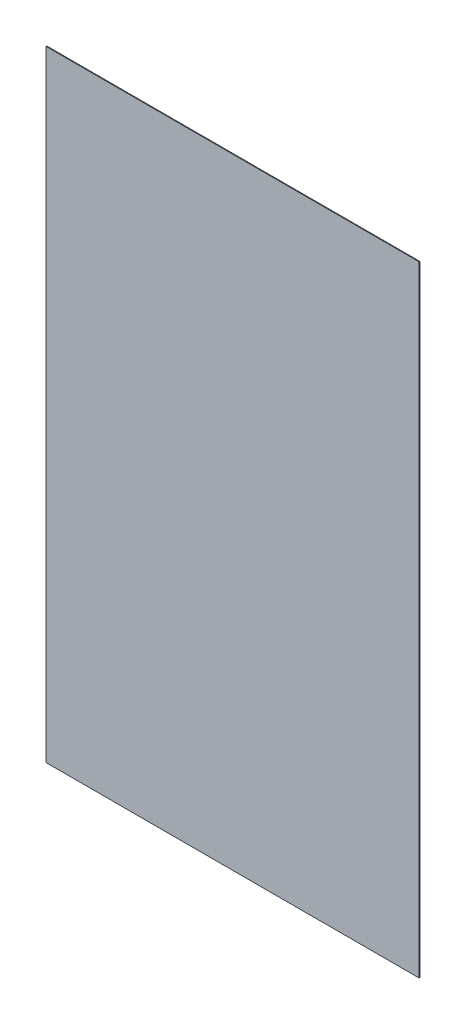
ISO-10303-21;
HEADER;
FILE_DESCRIPTION(('STEP AP214'),'2;1');
FILE_NAME('part.step','',(''),(''),'','','');
FILE_SCHEMA(('AUTOMOTIVE_DESIGN { 1 0 10303 214 1 1 1 1 }'));
ENDSEC;
DATA;
#1=APPLICATION_CONTEXT('core data for automotive mechanical design processes');
#2=APPLICATION_PROTOCOL_DEFINITION('international standard','automotive_design',2000,#1);
#3=PRODUCT_CONTEXT('',#1,'mechanical');
#4=PRODUCT('Part','Part','',(#3));
#5=PRODUCT_RELATED_PRODUCT_CATEGORY('part','',(#4));
#6=PRODUCT_DEFINITION_FORMATION('','',#4);
#7=PRODUCT_DEFINITION_CONTEXT('part definition',#1,'design');
#8=PRODUCT_DEFINITION('design','',#6,#7);
#9=PRODUCT_DEFINITION_SHAPE('','',#8);
#10=(LENGTH_UNIT() NAMED_UNIT(*) SI_UNIT(.MILLI.,.METRE.));
#11=(NAMED_UNIT(*) PLANE_ANGLE_UNIT() SI_UNIT($,.RADIAN.));
#12=(NAMED_UNIT(*) SI_UNIT($,.STERADIAN.) SOLID_ANGLE_UNIT());
#13=UNCERTAINTY_MEASURE_WITH_UNIT(LENGTH_MEASURE(1.E-05),#10,'distance_accuracy_value','');
#14=(GEOMETRIC_REPRESENTATION_CONTEXT(3) GLOBAL_UNCERTAINTY_ASSIGNED_CONTEXT((#13)) GLOBAL_UNIT_ASSIGNED_CONTEXT((#10,
#11,#12)) REPRESENTATION_CONTEXT('',''));
#15=CARTESIAN_POINT('',(0.,0.,0.));
#16=DIRECTION('',(0.,0.,1.));
#17=DIRECTION('',(1.,0.,0.));
#18=AXIS2_PLACEMENT_3D('',#15,#16,#17);
#19=CARTESIAN_POINT('',(0.,0.,2.));
#20=DIRECTION('',(1.,0.,0.));
#21=DIRECTION('',(0.,0.,-1.));
#22=AXIS2_PLACEMENT_3D('',#19,#20,#21);
#23=PLANE('',#22);
#24=DIRECTION('',(0.,-1.,0.));
#25=VECTOR('',#24,1.);
#26=CARTESIAN_POINT('',(0.,0.,0.));
#27=LINE('',#26,#25);
#28=CARTESIAN_POINT('',(0.,1662.9,0.));
#29=VERTEX_POINT('',#28);
#30=CARTESIAN_POINT('',(0.,0.,0.));
#31=VERTEX_POINT('',#30);
#32=EDGE_CURVE('E104',#29,#31,#27,.T.);
#33=ORIENTED_EDGE('',*,*,#32,.T.);
#34=DIRECTION('',(0.,0.,-1.));
#35=VECTOR('',#34,1.);
#36=CARTESIAN_POINT('',(0.,0.,2.));
#37=LINE('',#36,#35);
#38=CARTESIAN_POINT('',(0.,0.,2.));
#39=VERTEX_POINT('',#38);
#40=EDGE_CURVE('E11',#39,#31,#37,.T.);
#41=ORIENTED_EDGE('',*,*,#40,.F.);
#42=DIRECTION('',(0.,-1.,0.));
#43=VECTOR('',#42,1.);
#44=CARTESIAN_POINT('',(0.,0.,2.));
#45=LINE('',#44,#43);
#46=CARTESIAN_POINT('',(0.,1662.9,2.));
#47=VERTEX_POINT('',#46);
#48=EDGE_CURVE('E92',#47,#39,#45,.T.);
#49=ORIENTED_EDGE('',*,*,#48,.F.);
#50=DIRECTION('',(0.,0.,-1.));
#51=VECTOR('',#50,1.);
#52=CARTESIAN_POINT('',(0.,1662.9,2.));
#53=LINE('',#52,#51);
#54=EDGE_CURVE('E100',#47,#29,#53,.T.);
#55=ORIENTED_EDGE('',*,*,#54,.T.);
#56=EDGE_LOOP('',(#33,#41,#49,#55));
#57=FACE_BOUND('',#56,.T.);
#58=ADVANCED_FACE('F41',(#57),#23,.F.);
#59=CARTESIAN_POINT('',(0.,0.,2.));
#60=DIRECTION('',(0.,1.,0.));
#61=DIRECTION('',(0.,0.,1.));
#62=AXIS2_PLACEMENT_3D('',#59,#60,#61);
#63=PLANE('',#62);
#64=DIRECTION('',(1.,0.,0.));
#65=VECTOR('',#64,1.);
#66=CARTESIAN_POINT('',(0.,0.,0.));
#67=LINE('',#66,#65);
#68=CARTESIAN_POINT('',(1000.,0.,0.));
#69=VERTEX_POINT('',#68);
#70=EDGE_CURVE('E96',#31,#69,#67,.T.);
#71=ORIENTED_EDGE('',*,*,#70,.T.);
#72=DIRECTION('',(0.,0.,-1.));
#73=VECTOR('',#72,1.);
#74=CARTESIAN_POINT('',(1000.,0.,2.));
#75=LINE('',#74,#73);
#76=CARTESIAN_POINT('',(1000.,0.,2.));
#77=VERTEX_POINT('',#76);
#78=EDGE_CURVE('E49',#77,#69,#75,.T.);
#79=ORIENTED_EDGE('',*,*,#78,.F.);
#80=DIRECTION('',(1.,0.,0.));
#81=VECTOR('',#80,1.);
#82=CARTESIAN_POINT('',(0.,0.,2.));
#83=LINE('',#82,#81);
#84=EDGE_CURVE('E87',#39,#77,#83,.T.);
#85=ORIENTED_EDGE('',*,*,#84,.F.);
#86=ORIENTED_EDGE('',*,*,#40,.T.);
#87=EDGE_LOOP('',(#71,#79,#85,#86));
#88=FACE_BOUND('',#87,.T.);
#89=ADVANCED_FACE('F95',(#88),#63,.F.);
#90=CARTESIAN_POINT('',(1000.,0.,2.));
#91=DIRECTION('',(-1.,0.,0.));
#92=DIRECTION('',(0.,0.,1.));
#93=AXIS2_PLACEMENT_3D('',#90,#91,#92);
#94=PLANE('',#93);
#95=DIRECTION('',(0.,1.,0.));
#96=VECTOR('',#95,1.);
#97=CARTESIAN_POINT('',(1000.,0.,0.));
#98=LINE('',#97,#96);
#99=CARTESIAN_POINT('',(1000.,1662.9,0.));
#100=VERTEX_POINT('',#99);
#101=EDGE_CURVE('E74',#69,#100,#98,.T.);
#102=ORIENTED_EDGE('',*,*,#101,.T.);
#103=DIRECTION('',(0.,0.,-1.));
#104=VECTOR('',#103,1.);
#105=CARTESIAN_POINT('',(1000.,1662.9,2.));
#106=LINE('',#105,#104);
#107=CARTESIAN_POINT('',(1000.,1662.9,2.));
#108=VERTEX_POINT('',#107);
#109=EDGE_CURVE('E97',#108,#100,#106,.T.);
#110=ORIENTED_EDGE('',*,*,#109,.F.);
#111=DIRECTION('',(0.,1.,0.));
#112=VECTOR('',#111,1.);
#113=CARTESIAN_POINT('',(1000.,0.,2.));
#114=LINE('',#113,#112);
#115=EDGE_CURVE('E90',#77,#108,#114,.T.);
#116=ORIENTED_EDGE('',*,*,#115,.F.);
#117=ORIENTED_EDGE('',*,*,#78,.T.);
#118=EDGE_LOOP('',(#102,#110,#116,#117));
#119=FACE_BOUND('',#118,.T.);
#120=ADVANCED_FACE('F98',(#119),#94,.F.);
#121=CARTESIAN_POINT('',(0.,1662.9,2.));
#122=DIRECTION('',(0.,-1.,0.));
#123=DIRECTION('',(0.,0.,-1.));
#124=AXIS2_PLACEMENT_3D('',#121,#122,#123);
#125=PLANE('',#124);
#126=DIRECTION('',(-1.,0.,0.));
#127=VECTOR('',#126,1.);
#128=CARTESIAN_POINT('',(0.,1662.9,0.));
#129=LINE('',#128,#127);
#130=EDGE_CURVE('E80',#100,#29,#129,.T.);
#131=ORIENTED_EDGE('',*,*,#130,.T.);
#132=ORIENTED_EDGE('',*,*,#54,.F.);
#133=DIRECTION('',(-1.,0.,0.));
#134=VECTOR('',#133,1.);
#135=CARTESIAN_POINT('',(0.,1662.9,2.));
#136=LINE('',#135,#134);
#137=EDGE_CURVE('E57',#108,#47,#136,.T.);
#138=ORIENTED_EDGE('',*,*,#137,.F.);
#139=ORIENTED_EDGE('',*,*,#109,.T.);
#140=EDGE_LOOP('',(#131,#132,#138,#139));
#141=FACE_BOUND('',#140,.T.);
#142=ADVANCED_FACE('F111',(#141),#125,.F.);
#143=CARTESIAN_POINT('',(0.,0.,2.));
#144=DIRECTION('',(0.,0.,-1.));
#145=DIRECTION('',(-1.,0.,0.));
#146=AXIS2_PLACEMENT_3D('',#143,#144,#145);
#147=PLANE('',#146);
#148=ORIENTED_EDGE('',*,*,#48,.T.);
#149=ORIENTED_EDGE('',*,*,#84,.T.);
#150=ORIENTED_EDGE('',*,*,#115,.T.);
#151=ORIENTED_EDGE('',*,*,#137,.T.);
#152=EDGE_LOOP('',(#148,#149,#150,#151));
#153=FACE_BOUND('',#152,.T.);
#154=ADVANCED_FACE('F88',(#153),#147,.F.);
#155=CARTESIAN_POINT('',(0.,0.,0.));
#156=DIRECTION('',(0.,0.,-1.));
#157=DIRECTION('',(-1.,0.,0.));
#158=AXIS2_PLACEMENT_3D('',#155,#156,#157);
#159=PLANE('',#158);
#160=ORIENTED_EDGE('',*,*,#32,.F.);
#161=ORIENTED_EDGE('',*,*,#130,.F.);
#162=ORIENTED_EDGE('',*,*,#101,.F.);
#163=ORIENTED_EDGE('',*,*,#70,.F.);
#164=EDGE_LOOP('',(#160,#161,#162,#163));
#165=FACE_BOUND('',#164,.T.);
#166=ADVANCED_FACE('F114',(#165),#159,.T.);
#167=CLOSED_SHELL('',(#58,#89,#120,#142,#154,#166));
#168=MANIFOLD_SOLID_BREP('B2',#167);
#169=ADVANCED_BREP_SHAPE_REPRESENTATION('',(#18,#168),#14);
#170=SHAPE_DEFINITION_REPRESENTATION(#9,#169);
ENDSEC;
END-ISO-10303-21;
